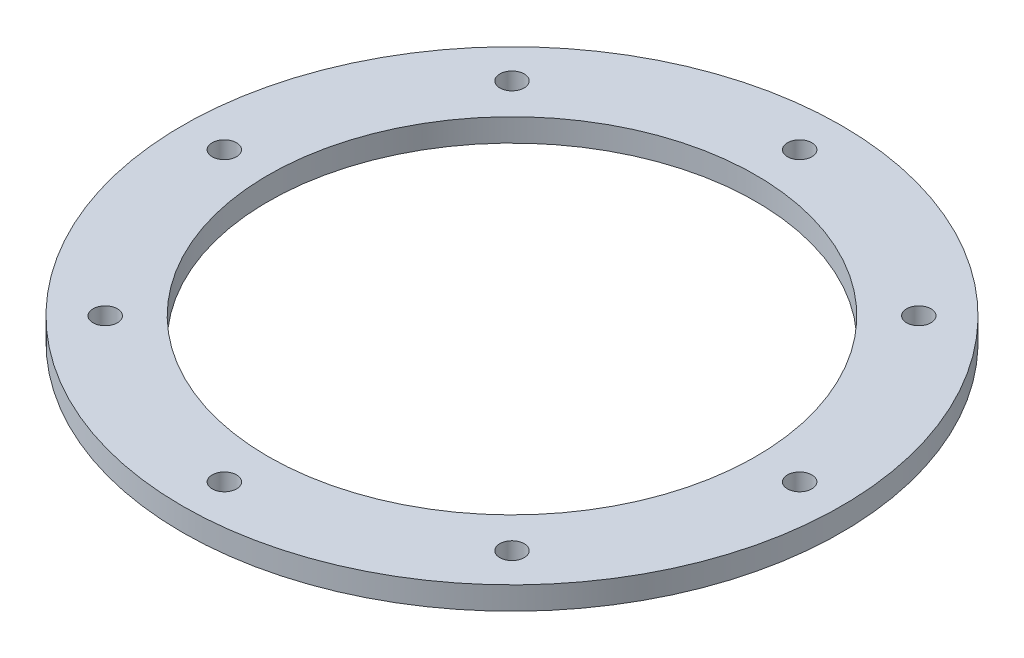
ISO-10303-21;
HEADER;
FILE_DESCRIPTION(('STEP AP214'),'2;1');
FILE_NAME('part.step','',(''),(''),'','','');
FILE_SCHEMA(('AUTOMOTIVE_DESIGN { 1 0 10303 214 1 1 1 1 }'));
ENDSEC;
DATA;
#1=APPLICATION_CONTEXT('core data for automotive mechanical design processes');
#2=APPLICATION_PROTOCOL_DEFINITION('international standard','automotive_design',2000,#1);
#3=PRODUCT_CONTEXT('',#1,'mechanical');
#4=PRODUCT('Part','Part','',(#3));
#5=PRODUCT_RELATED_PRODUCT_CATEGORY('part','',(#4));
#6=PRODUCT_DEFINITION_FORMATION('','',#4);
#7=PRODUCT_DEFINITION_CONTEXT('part definition',#1,'design');
#8=PRODUCT_DEFINITION('design','',#6,#7);
#9=PRODUCT_DEFINITION_SHAPE('','',#8);
#10=(LENGTH_UNIT() NAMED_UNIT(*) SI_UNIT(.MILLI.,.METRE.));
#11=(NAMED_UNIT(*) PLANE_ANGLE_UNIT() SI_UNIT($,.RADIAN.));
#12=(NAMED_UNIT(*) SI_UNIT($,.STERADIAN.) SOLID_ANGLE_UNIT());
#13=UNCERTAINTY_MEASURE_WITH_UNIT(LENGTH_MEASURE(1.E-05),#10,'distance_accuracy_value','');
#14=(GEOMETRIC_REPRESENTATION_CONTEXT(3) GLOBAL_UNCERTAINTY_ASSIGNED_CONTEXT((#13)) GLOBAL_UNIT_ASSIGNED_CONTEXT((#10,
#11,#12)) REPRESENTATION_CONTEXT('',''));
#15=CARTESIAN_POINT('',(0.,0.,0.));
#16=DIRECTION('',(0.,0.,1.));
#17=DIRECTION('',(1.,0.,0.));
#18=AXIS2_PLACEMENT_3D('',#15,#16,#17);
#19=CARTESIAN_POINT('',(0.,3.,0.));
#20=DIRECTION('',(0.,1.,0.));
#21=DIRECTION('',(0.,0.,1.));
#22=AXIS2_PLACEMENT_3D('',#19,#20,#21);
#23=PLANE('',#22);
#24=CARTESIAN_POINT('',(-37.75,3.,0.));
#25=DIRECTION('',(0.,1.,0.));
#26=DIRECTION('',(0.,0.,1.));
#27=AXIS2_PLACEMENT_3D('',#24,#25,#26);
#28=CIRCLE('',#27,1.6);
#29=CARTESIAN_POINT('',(-37.75,3.,1.6));
#30=VERTEX_POINT('',#29);
#31=EDGE_CURVE('E108',#30,#30,#28,.T.);
#32=ORIENTED_EDGE('',*,*,#31,.F.);
#33=EDGE_LOOP('',(#32));
#34=FACE_BOUND('',#33,.T.);
#35=CARTESIAN_POINT('',(0.,3.,37.75));
#36=DIRECTION('',(0.,1.,0.));
#37=DIRECTION('',(0.,0.,1.));
#38=AXIS2_PLACEMENT_3D('',#35,#36,#37);
#39=CIRCLE('',#38,1.6);
#40=CARTESIAN_POINT('',(0.,3.,39.35));
#41=VERTEX_POINT('',#40);
#42=EDGE_CURVE('E92',#41,#41,#39,.T.);
#43=ORIENTED_EDGE('',*,*,#42,.F.);
#44=EDGE_LOOP('',(#43));
#45=FACE_BOUND('',#44,.T.);
#46=CARTESIAN_POINT('',(37.75,3.,0.));
#47=DIRECTION('',(0.,1.,0.));
#48=DIRECTION('',(0.,0.,1.));
#49=AXIS2_PLACEMENT_3D('',#46,#47,#48);
#50=CIRCLE('',#49,1.6);
#51=CARTESIAN_POINT('',(37.75,3.,1.6));
#52=VERTEX_POINT('',#51);
#53=EDGE_CURVE('E76',#52,#52,#50,.T.);
#54=ORIENTED_EDGE('',*,*,#53,.F.);
#55=EDGE_LOOP('',(#54));
#56=FACE_BOUND('',#55,.T.);
#57=CARTESIAN_POINT('',(0.,3.,-37.75));
#58=DIRECTION('',(0.,1.,0.));
#59=DIRECTION('',(0.,0.,1.));
#60=AXIS2_PLACEMENT_3D('',#57,#58,#59);
#61=CIRCLE('',#60,1.6);
#62=CARTESIAN_POINT('',(0.,3.,-36.15));
#63=VERTEX_POINT('',#62);
#64=EDGE_CURVE('E60',#63,#63,#61,.T.);
#65=ORIENTED_EDGE('',*,*,#64,.F.);
#66=EDGE_LOOP('',(#65));
#67=FACE_BOUND('',#66,.T.);
#68=CARTESIAN_POINT('',(0.,3.,0.));
#69=DIRECTION('',(0.,1.,0.));
#70=DIRECTION('',(0.,0.,1.));
#71=AXIS2_PLACEMENT_3D('',#68,#69,#70);
#72=CIRCLE('',#71,43.25);
#73=CARTESIAN_POINT('',(0.,3.,43.25));
#74=VERTEX_POINT('',#73);
#75=EDGE_CURVE('E10',#74,#74,#72,.T.);
#76=ORIENTED_EDGE('',*,*,#75,.T.);
#77=EDGE_LOOP('',(#76));
#78=FACE_BOUND('',#77,.T.);
#79=CARTESIAN_POINT('',(0.,3.,0.));
#80=DIRECTION('',(0.,1.,0.));
#81=DIRECTION('',(0.,0.,1.));
#82=AXIS2_PLACEMENT_3D('',#79,#80,#81);
#83=CIRCLE('',#82,32.);
#84=CARTESIAN_POINT('',(0.,3.,32.));
#85=VERTEX_POINT('',#84);
#86=EDGE_CURVE('E54',#85,#85,#83,.T.);
#87=ORIENTED_EDGE('',*,*,#86,.F.);
#88=EDGE_LOOP('',(#87));
#89=FACE_BOUND('',#88,.T.);
#90=CARTESIAN_POINT('',(26.6932809897922,3.,-26.6932809897922));
#91=DIRECTION('',(0.,1.,0.));
#92=DIRECTION('',(0.,0.,1.));
#93=AXIS2_PLACEMENT_3D('',#90,#91,#92);
#94=CIRCLE('',#93,1.6);
#95=CARTESIAN_POINT('',(26.6932809897922,3.,-25.0932809897922));
#96=VERTEX_POINT('',#95);
#97=EDGE_CURVE('E68',#96,#96,#94,.T.);
#98=ORIENTED_EDGE('',*,*,#97,.F.);
#99=EDGE_LOOP('',(#98));
#100=FACE_BOUND('',#99,.T.);
#101=CARTESIAN_POINT('',(26.6932809897922,3.,26.6932809897922));
#102=DIRECTION('',(0.,1.,0.));
#103=DIRECTION('',(0.,0.,1.));
#104=AXIS2_PLACEMENT_3D('',#101,#102,#103);
#105=CIRCLE('',#104,1.6);
#106=CARTESIAN_POINT('',(26.6932809897922,3.,28.2932809897922));
#107=VERTEX_POINT('',#106);
#108=EDGE_CURVE('E84',#107,#107,#105,.T.);
#109=ORIENTED_EDGE('',*,*,#108,.F.);
#110=EDGE_LOOP('',(#109));
#111=FACE_BOUND('',#110,.T.);
#112=CARTESIAN_POINT('',(-26.6932809897922,3.,26.6932809897922));
#113=DIRECTION('',(0.,1.,0.));
#114=DIRECTION('',(0.,0.,1.));
#115=AXIS2_PLACEMENT_3D('',#112,#113,#114);
#116=CIRCLE('',#115,1.6);
#117=CARTESIAN_POINT('',(-26.6932809897922,3.,28.2932809897922));
#118=VERTEX_POINT('',#117);
#119=EDGE_CURVE('E100',#118,#118,#116,.T.);
#120=ORIENTED_EDGE('',*,*,#119,.F.);
#121=EDGE_LOOP('',(#120));
#122=FACE_BOUND('',#121,.T.);
#123=CARTESIAN_POINT('',(-26.6932809897922,3.,-26.6932809897922));
#124=DIRECTION('',(0.,1.,0.));
#125=DIRECTION('',(0.,0.,1.));
#126=AXIS2_PLACEMENT_3D('',#123,#124,#125);
#127=CIRCLE('',#126,1.6);
#128=CARTESIAN_POINT('',(-26.6932809897922,3.,-25.0932809897922));
#129=VERTEX_POINT('',#128);
#130=EDGE_CURVE('E116',#129,#129,#127,.T.);
#131=ORIENTED_EDGE('',*,*,#130,.F.);
#132=EDGE_LOOP('',(#131));
#133=FACE_BOUND('',#132,.T.);
#134=ADVANCED_FACE('F41',(#34,#45,#56,#67,#78,#89,#100,#111,#122,#133),#23,.T.);
#135=CARTESIAN_POINT('',(0.,0.,0.));
#136=DIRECTION('',(0.,1.,0.));
#137=DIRECTION('',(0.,0.,1.));
#138=AXIS2_PLACEMENT_3D('',#135,#136,#137);
#139=PLANE('',#138);
#140=CARTESIAN_POINT('',(0.,0.,0.));
#141=DIRECTION('',(0.,1.,0.));
#142=DIRECTION('',(0.,0.,1.));
#143=AXIS2_PLACEMENT_3D('',#140,#141,#142);
#144=CIRCLE('',#143,43.25);
#145=CARTESIAN_POINT('',(0.,0.,43.25));
#146=VERTEX_POINT('',#145);
#147=EDGE_CURVE('E45',#146,#146,#144,.T.);
#148=ORIENTED_EDGE('',*,*,#147,.F.);
#149=EDGE_LOOP('',(#148));
#150=FACE_BOUND('',#149,.T.);
#151=CARTESIAN_POINT('',(0.,0.,0.));
#152=DIRECTION('',(0.,1.,0.));
#153=DIRECTION('',(0.,0.,1.));
#154=AXIS2_PLACEMENT_3D('',#151,#152,#153);
#155=CIRCLE('',#154,32.);
#156=CARTESIAN_POINT('',(0.,0.,32.));
#157=VERTEX_POINT('',#156);
#158=EDGE_CURVE('E56',#157,#157,#155,.T.);
#159=ORIENTED_EDGE('',*,*,#158,.T.);
#160=EDGE_LOOP('',(#159));
#161=FACE_BOUND('',#160,.T.);
#162=CARTESIAN_POINT('',(0.,0.,-37.75));
#163=DIRECTION('',(0.,1.,0.));
#164=DIRECTION('',(0.,0.,1.));
#165=AXIS2_PLACEMENT_3D('',#162,#163,#164);
#166=CIRCLE('',#165,1.6);
#167=CARTESIAN_POINT('',(0.,0.,-36.15));
#168=VERTEX_POINT('',#167);
#169=EDGE_CURVE('E64',#168,#168,#166,.T.);
#170=ORIENTED_EDGE('',*,*,#169,.T.);
#171=EDGE_LOOP('',(#170));
#172=FACE_BOUND('',#171,.T.);
#173=CARTESIAN_POINT('',(26.6932809897922,0.,-26.6932809897922));
#174=DIRECTION('',(0.,1.,0.));
#175=DIRECTION('',(0.,0.,1.));
#176=AXIS2_PLACEMENT_3D('',#173,#174,#175);
#177=CIRCLE('',#176,1.6);
#178=CARTESIAN_POINT('',(26.6932809897922,0.,-25.0932809897922));
#179=VERTEX_POINT('',#178);
#180=EDGE_CURVE('E72',#179,#179,#177,.T.);
#181=ORIENTED_EDGE('',*,*,#180,.T.);
#182=EDGE_LOOP('',(#181));
#183=FACE_BOUND('',#182,.T.);
#184=CARTESIAN_POINT('',(37.75,0.,0.));
#185=DIRECTION('',(0.,1.,0.));
#186=DIRECTION('',(0.,0.,1.));
#187=AXIS2_PLACEMENT_3D('',#184,#185,#186);
#188=CIRCLE('',#187,1.6);
#189=CARTESIAN_POINT('',(37.75,0.,1.6));
#190=VERTEX_POINT('',#189);
#191=EDGE_CURVE('E80',#190,#190,#188,.T.);
#192=ORIENTED_EDGE('',*,*,#191,.T.);
#193=EDGE_LOOP('',(#192));
#194=FACE_BOUND('',#193,.T.);
#195=CARTESIAN_POINT('',(26.6932809897922,0.,26.6932809897922));
#196=DIRECTION('',(0.,1.,0.));
#197=DIRECTION('',(0.,0.,1.));
#198=AXIS2_PLACEMENT_3D('',#195,#196,#197);
#199=CIRCLE('',#198,1.6);
#200=CARTESIAN_POINT('',(26.6932809897922,0.,28.2932809897922));
#201=VERTEX_POINT('',#200);
#202=EDGE_CURVE('E88',#201,#201,#199,.T.);
#203=ORIENTED_EDGE('',*,*,#202,.T.);
#204=EDGE_LOOP('',(#203));
#205=FACE_BOUND('',#204,.T.);
#206=CARTESIAN_POINT('',(0.,0.,37.75));
#207=DIRECTION('',(0.,1.,0.));
#208=DIRECTION('',(0.,0.,1.));
#209=AXIS2_PLACEMENT_3D('',#206,#207,#208);
#210=CIRCLE('',#209,1.6);
#211=CARTESIAN_POINT('',(0.,0.,39.35));
#212=VERTEX_POINT('',#211);
#213=EDGE_CURVE('E96',#212,#212,#210,.T.);
#214=ORIENTED_EDGE('',*,*,#213,.T.);
#215=EDGE_LOOP('',(#214));
#216=FACE_BOUND('',#215,.T.);
#217=CARTESIAN_POINT('',(-26.6932809897922,0.,26.6932809897922));
#218=DIRECTION('',(0.,1.,0.));
#219=DIRECTION('',(0.,0.,1.));
#220=AXIS2_PLACEMENT_3D('',#217,#218,#219);
#221=CIRCLE('',#220,1.6);
#222=CARTESIAN_POINT('',(-26.6932809897922,0.,28.2932809897922));
#223=VERTEX_POINT('',#222);
#224=EDGE_CURVE('E104',#223,#223,#221,.T.);
#225=ORIENTED_EDGE('',*,*,#224,.T.);
#226=EDGE_LOOP('',(#225));
#227=FACE_BOUND('',#226,.T.);
#228=CARTESIAN_POINT('',(-37.75,0.,0.));
#229=DIRECTION('',(0.,1.,0.));
#230=DIRECTION('',(0.,0.,1.));
#231=AXIS2_PLACEMENT_3D('',#228,#229,#230);
#232=CIRCLE('',#231,1.6);
#233=CARTESIAN_POINT('',(-37.75,0.,1.6));
#234=VERTEX_POINT('',#233);
#235=EDGE_CURVE('E112',#234,#234,#232,.T.);
#236=ORIENTED_EDGE('',*,*,#235,.T.);
#237=EDGE_LOOP('',(#236));
#238=FACE_BOUND('',#237,.T.);
#239=CARTESIAN_POINT('',(-26.6932809897922,0.,-26.6932809897922));
#240=DIRECTION('',(0.,1.,0.));
#241=DIRECTION('',(0.,0.,1.));
#242=AXIS2_PLACEMENT_3D('',#239,#240,#241);
#243=CIRCLE('',#242,1.6);
#244=CARTESIAN_POINT('',(-26.6932809897922,0.,-25.0932809897922));
#245=VERTEX_POINT('',#244);
#246=EDGE_CURVE('E120',#245,#245,#243,.T.);
#247=ORIENTED_EDGE('',*,*,#246,.T.);
#248=EDGE_LOOP('',(#247));
#249=FACE_BOUND('',#248,.T.);
#250=ADVANCED_FACE('F132',(#150,#161,#172,#183,#194,#205,#216,#227,#238,#249),#139,.F.);
#251=CARTESIAN_POINT('',(0.,3.,0.));
#252=DIRECTION('',(0.,-1.,0.));
#253=DIRECTION('',(0.,0.,-1.));
#254=AXIS2_PLACEMENT_3D('',#251,#252,#253);
#255=CYLINDRICAL_SURFACE('',#254,43.25);
#256=ORIENTED_EDGE('',*,*,#75,.F.);
#257=EDGE_LOOP('',(#256));
#258=FACE_BOUND('',#257,.T.);
#259=ORIENTED_EDGE('',*,*,#147,.T.);
#260=EDGE_LOOP('',(#259));
#261=FACE_BOUND('',#260,.T.);
#262=ADVANCED_FACE('F43',(#258,#261),#255,.T.);
#263=CARTESIAN_POINT('',(0.,3.,0.));
#264=DIRECTION('',(0.,-1.,0.));
#265=DIRECTION('',(0.,0.,-1.));
#266=AXIS2_PLACEMENT_3D('',#263,#264,#265);
#267=CYLINDRICAL_SURFACE('',#266,32.);
#268=ORIENTED_EDGE('',*,*,#86,.T.);
#269=EDGE_LOOP('',(#268));
#270=FACE_BOUND('',#269,.T.);
#271=ORIENTED_EDGE('',*,*,#158,.F.);
#272=EDGE_LOOP('',(#271));
#273=FACE_BOUND('',#272,.T.);
#274=ADVANCED_FACE('F142',(#270,#273),#267,.F.);
#275=CARTESIAN_POINT('',(0.,3.,-37.75));
#276=DIRECTION('',(0.,-1.,0.));
#277=DIRECTION('',(0.,0.,-1.));
#278=AXIS2_PLACEMENT_3D('',#275,#276,#277);
#279=CYLINDRICAL_SURFACE('',#278,1.6);
#280=ORIENTED_EDGE('',*,*,#64,.T.);
#281=EDGE_LOOP('',(#280));
#282=FACE_BOUND('',#281,.T.);
#283=ORIENTED_EDGE('',*,*,#169,.F.);
#284=EDGE_LOOP('',(#283));
#285=FACE_BOUND('',#284,.T.);
#286=ADVANCED_FACE('F145',(#282,#285),#279,.F.);
#287=CARTESIAN_POINT('',(26.6932809897922,3.,-26.6932809897922));
#288=DIRECTION('',(0.,-1.,0.));
#289=DIRECTION('',(0.,0.,-1.));
#290=AXIS2_PLACEMENT_3D('',#287,#288,#289);
#291=CYLINDRICAL_SURFACE('',#290,1.6);
#292=ORIENTED_EDGE('',*,*,#97,.T.);
#293=EDGE_LOOP('',(#292));
#294=FACE_BOUND('',#293,.T.);
#295=ORIENTED_EDGE('',*,*,#180,.F.);
#296=EDGE_LOOP('',(#295));
#297=FACE_BOUND('',#296,.T.);
#298=ADVANCED_FACE('F149',(#294,#297),#291,.F.);
#299=CARTESIAN_POINT('',(37.75,3.,0.));
#300=DIRECTION('',(0.,-1.,0.));
#301=DIRECTION('',(0.,0.,-1.));
#302=AXIS2_PLACEMENT_3D('',#299,#300,#301);
#303=CYLINDRICAL_SURFACE('',#302,1.6);
#304=ORIENTED_EDGE('',*,*,#53,.T.);
#305=EDGE_LOOP('',(#304));
#306=FACE_BOUND('',#305,.T.);
#307=ORIENTED_EDGE('',*,*,#191,.F.);
#308=EDGE_LOOP('',(#307));
#309=FACE_BOUND('',#308,.T.);
#310=ADVANCED_FACE('F153',(#306,#309),#303,.F.);
#311=CARTESIAN_POINT('',(26.6932809897922,3.,26.6932809897922));
#312=DIRECTION('',(0.,-1.,0.));
#313=DIRECTION('',(0.,0.,-1.));
#314=AXIS2_PLACEMENT_3D('',#311,#312,#313);
#315=CYLINDRICAL_SURFACE('',#314,1.6);
#316=ORIENTED_EDGE('',*,*,#108,.T.);
#317=EDGE_LOOP('',(#316));
#318=FACE_BOUND('',#317,.T.);
#319=ORIENTED_EDGE('',*,*,#202,.F.);
#320=EDGE_LOOP('',(#319));
#321=FACE_BOUND('',#320,.T.);
#322=ADVANCED_FACE('F157',(#318,#321),#315,.F.);
#323=CARTESIAN_POINT('',(0.,3.,37.75));
#324=DIRECTION('',(0.,-1.,0.));
#325=DIRECTION('',(0.,0.,-1.));
#326=AXIS2_PLACEMENT_3D('',#323,#324,#325);
#327=CYLINDRICAL_SURFACE('',#326,1.6);
#328=ORIENTED_EDGE('',*,*,#42,.T.);
#329=EDGE_LOOP('',(#328));
#330=FACE_BOUND('',#329,.T.);
#331=ORIENTED_EDGE('',*,*,#213,.F.);
#332=EDGE_LOOP('',(#331));
#333=FACE_BOUND('',#332,.T.);
#334=ADVANCED_FACE('F161',(#330,#333),#327,.F.);
#335=CARTESIAN_POINT('',(-26.6932809897922,3.,26.6932809897922));
#336=DIRECTION('',(0.,-1.,0.));
#337=DIRECTION('',(0.,0.,-1.));
#338=AXIS2_PLACEMENT_3D('',#335,#336,#337);
#339=CYLINDRICAL_SURFACE('',#338,1.6);
#340=ORIENTED_EDGE('',*,*,#119,.T.);
#341=EDGE_LOOP('',(#340));
#342=FACE_BOUND('',#341,.T.);
#343=ORIENTED_EDGE('',*,*,#224,.F.);
#344=EDGE_LOOP('',(#343));
#345=FACE_BOUND('',#344,.T.);
#346=ADVANCED_FACE('F165',(#342,#345),#339,.F.);
#347=CARTESIAN_POINT('',(-37.75,3.,0.));
#348=DIRECTION('',(0.,-1.,0.));
#349=DIRECTION('',(0.,0.,-1.));
#350=AXIS2_PLACEMENT_3D('',#347,#348,#349);
#351=CYLINDRICAL_SURFACE('',#350,1.6);
#352=ORIENTED_EDGE('',*,*,#31,.T.);
#353=EDGE_LOOP('',(#352));
#354=FACE_BOUND('',#353,.T.);
#355=ORIENTED_EDGE('',*,*,#235,.F.);
#356=EDGE_LOOP('',(#355));
#357=FACE_BOUND('',#356,.T.);
#358=ADVANCED_FACE('F169',(#354,#357),#351,.F.);
#359=CARTESIAN_POINT('',(-26.6932809897922,3.,-26.6932809897922));
#360=DIRECTION('',(0.,-1.,0.));
#361=DIRECTION('',(0.,0.,-1.));
#362=AXIS2_PLACEMENT_3D('',#359,#360,#361);
#363=CYLINDRICAL_SURFACE('',#362,1.6);
#364=ORIENTED_EDGE('',*,*,#130,.T.);
#365=EDGE_LOOP('',(#364));
#366=FACE_BOUND('',#365,.T.);
#367=ORIENTED_EDGE('',*,*,#246,.F.);
#368=EDGE_LOOP('',(#367));
#369=FACE_BOUND('',#368,.T.);
#370=ADVANCED_FACE('F128',(#366,#369),#363,.F.);
#371=CLOSED_SHELL('',(#134,#250,#262,#274,#286,#298,#310,#322,#334,#346,#358,#370));
#372=MANIFOLD_SOLID_BREP('B2',#371);
#373=ADVANCED_BREP_SHAPE_REPRESENTATION('',(#18,#372),#14);
#374=SHAPE_DEFINITION_REPRESENTATION(#9,#373);
ENDSEC;
END-ISO-10303-21;
